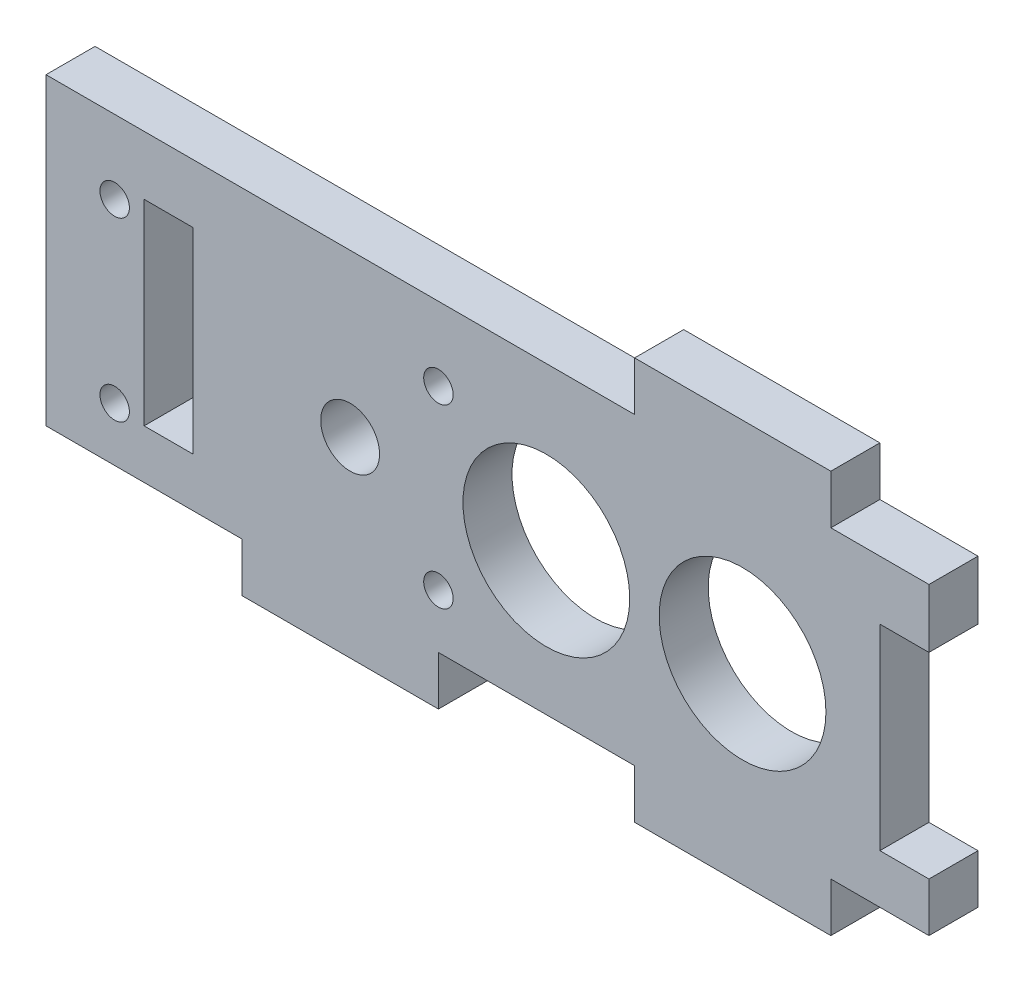
ISO-10303-21;
HEADER;
FILE_DESCRIPTION(('STEP AP214'),'2;1');
FILE_NAME('part.step','',(''),(''),'','','');
FILE_SCHEMA(('AUTOMOTIVE_DESIGN { 1 0 10303 214 1 1 1 1 }'));
ENDSEC;
DATA;
#1=APPLICATION_CONTEXT('core data for automotive mechanical design processes');
#2=APPLICATION_PROTOCOL_DEFINITION('international standard','automotive_design',2000,#1);
#3=PRODUCT_CONTEXT('',#1,'mechanical');
#4=PRODUCT('Part','Part','',(#3));
#5=PRODUCT_RELATED_PRODUCT_CATEGORY('part','',(#4));
#6=PRODUCT_DEFINITION_FORMATION('','',#4);
#7=PRODUCT_DEFINITION_CONTEXT('part definition',#1,'design');
#8=PRODUCT_DEFINITION('design','',#6,#7);
#9=PRODUCT_DEFINITION_SHAPE('','',#8);
#10=(LENGTH_UNIT() NAMED_UNIT(*) SI_UNIT(.MILLI.,.METRE.));
#11=(NAMED_UNIT(*) PLANE_ANGLE_UNIT() SI_UNIT($,.RADIAN.));
#12=(NAMED_UNIT(*) SI_UNIT($,.STERADIAN.) SOLID_ANGLE_UNIT());
#13=UNCERTAINTY_MEASURE_WITH_UNIT(LENGTH_MEASURE(1.E-05),#10,'distance_accuracy_value','');
#14=(GEOMETRIC_REPRESENTATION_CONTEXT(3) GLOBAL_UNCERTAINTY_ASSIGNED_CONTEXT((#13)) GLOBAL_UNIT_ASSIGNED_CONTEXT((#10,
#11,#12)) REPRESENTATION_CONTEXT('',''));
#15=CARTESIAN_POINT('',(0.,0.,0.));
#16=DIRECTION('',(0.,0.,1.));
#17=DIRECTION('',(1.,0.,0.));
#18=AXIS2_PLACEMENT_3D('',#15,#16,#17);
#19=CARTESIAN_POINT('',(0.,31.,-5.));
#20=DIRECTION('',(0.,-1.,0.));
#21=DIRECTION('',(0.,0.,-1.));
#22=AXIS2_PLACEMENT_3D('',#19,#20,#21);
#23=PLANE('',#22);
#24=DIRECTION('',(1.,0.,0.));
#25=VECTOR('',#24,1.);
#26=CARTESIAN_POINT('',(0.,31.,0.));
#27=LINE('',#26,#25);
#28=CARTESIAN_POINT('',(-10.,31.,0.));
#29=VERTEX_POINT('',#28);
#30=CARTESIAN_POINT('',(50.,31.,0.));
#31=VERTEX_POINT('',#30);
#32=EDGE_CURVE('E322',#29,#31,#27,.T.);
#33=ORIENTED_EDGE('',*,*,#32,.T.);
#34=DIRECTION('',(0.,0.,1.));
#35=VECTOR('',#34,1.);
#36=CARTESIAN_POINT('',(50.,31.,-5.));
#37=LINE('',#36,#35);
#38=CARTESIAN_POINT('',(50.,31.,-5.));
#39=VERTEX_POINT('',#38);
#40=EDGE_CURVE('E11',#39,#31,#37,.T.);
#41=ORIENTED_EDGE('',*,*,#40,.F.);
#42=DIRECTION('',(1.,0.,0.));
#43=VECTOR('',#42,1.);
#44=CARTESIAN_POINT('',(0.,31.,-5.));
#45=LINE('',#44,#43);
#46=CARTESIAN_POINT('',(-10.,31.,-5.));
#47=VERTEX_POINT('',#46);
#48=EDGE_CURVE('E259',#47,#39,#45,.T.);
#49=ORIENTED_EDGE('',*,*,#48,.F.);
#50=DIRECTION('',(0.,0.,-1.));
#51=VECTOR('',#50,1.);
#52=CARTESIAN_POINT('',(-10.,31.,-5.));
#53=LINE('',#52,#51);
#54=EDGE_CURVE('E245',#29,#47,#53,.T.);
#55=ORIENTED_EDGE('',*,*,#54,.F.);
#56=EDGE_LOOP('',(#33,#41,#49,#55));
#57=FACE_BOUND('',#56,.T.);
#58=ADVANCED_FACE('F36',(#57),#23,.F.);
#59=CARTESIAN_POINT('',(50.,0.,-5.));
#60=DIRECTION('',(1.,0.,0.));
#61=DIRECTION('',(0.,0.,-1.));
#62=AXIS2_PLACEMENT_3D('',#59,#60,#61);
#63=PLANE('',#62);
#64=DIRECTION('',(0.,1.,0.));
#65=VECTOR('',#64,1.);
#66=CARTESIAN_POINT('',(50.,0.,0.));
#67=LINE('',#66,#65);
#68=CARTESIAN_POINT('',(50.,36.,0.));
#69=VERTEX_POINT('',#68);
#70=EDGE_CURVE('E374',#31,#69,#67,.T.);
#71=ORIENTED_EDGE('',*,*,#70,.T.);
#72=DIRECTION('',(0.,0.,1.));
#73=VECTOR('',#72,1.);
#74=CARTESIAN_POINT('',(50.,36.,-5.));
#75=LINE('',#74,#73);
#76=CARTESIAN_POINT('',(50.,36.,-5.));
#77=VERTEX_POINT('',#76);
#78=EDGE_CURVE('E45',#77,#69,#75,.T.);
#79=ORIENTED_EDGE('',*,*,#78,.F.);
#80=DIRECTION('',(0.,1.,0.));
#81=VECTOR('',#80,1.);
#82=CARTESIAN_POINT('',(50.,0.,-5.));
#83=LINE('',#82,#81);
#84=EDGE_CURVE('E306',#39,#77,#83,.T.);
#85=ORIENTED_EDGE('',*,*,#84,.F.);
#86=ORIENTED_EDGE('',*,*,#40,.T.);
#87=EDGE_LOOP('',(#71,#79,#85,#86));
#88=FACE_BOUND('',#87,.T.);
#89=ADVANCED_FACE('F499',(#88),#63,.F.);
#90=CARTESIAN_POINT('',(0.,36.,-5.));
#91=DIRECTION('',(0.,-1.,0.));
#92=DIRECTION('',(0.,0.,-1.));
#93=AXIS2_PLACEMENT_3D('',#90,#91,#92);
#94=PLANE('',#93);
#95=DIRECTION('',(1.,0.,0.));
#96=VECTOR('',#95,1.);
#97=CARTESIAN_POINT('',(0.,36.,0.));
#98=LINE('',#97,#96);
#99=CARTESIAN_POINT('',(70.,36.,0.));
#100=VERTEX_POINT('',#99);
#101=EDGE_CURVE('E371',#69,#100,#98,.T.);
#102=ORIENTED_EDGE('',*,*,#101,.T.);
#103=DIRECTION('',(0.,0.,1.));
#104=VECTOR('',#103,1.);
#105=CARTESIAN_POINT('',(70.,36.,-5.));
#106=LINE('',#105,#104);
#107=CARTESIAN_POINT('',(70.,36.,-5.));
#108=VERTEX_POINT('',#107);
#109=EDGE_CURVE('E383',#108,#100,#106,.T.);
#110=ORIENTED_EDGE('',*,*,#109,.F.);
#111=DIRECTION('',(1.,0.,0.));
#112=VECTOR('',#111,1.);
#113=CARTESIAN_POINT('',(0.,36.,-5.));
#114=LINE('',#113,#112);
#115=EDGE_CURVE('E304',#77,#108,#114,.T.);
#116=ORIENTED_EDGE('',*,*,#115,.F.);
#117=ORIENTED_EDGE('',*,*,#78,.T.);
#118=EDGE_LOOP('',(#102,#110,#116,#117));
#119=FACE_BOUND('',#118,.T.);
#120=ADVANCED_FACE('F497',(#119),#94,.F.);
#121=CARTESIAN_POINT('',(70.,0.,-5.));
#122=DIRECTION('',(1.,0.,0.));
#123=DIRECTION('',(0.,0.,-1.));
#124=AXIS2_PLACEMENT_3D('',#121,#122,#123);
#125=PLANE('',#124);
#126=DIRECTION('',(0.,1.,0.));
#127=VECTOR('',#126,1.);
#128=CARTESIAN_POINT('',(70.,0.,0.));
#129=LINE('',#128,#127);
#130=CARTESIAN_POINT('',(70.,31.,0.));
#131=VERTEX_POINT('',#130);
#132=EDGE_CURVE('E368',#131,#100,#129,.T.);
#133=ORIENTED_EDGE('',*,*,#132,.F.);
#134=DIRECTION('',(0.,0.,1.));
#135=VECTOR('',#134,1.);
#136=CARTESIAN_POINT('',(70.,31.,-5.));
#137=LINE('',#136,#135);
#138=CARTESIAN_POINT('',(70.,31.,-5.));
#139=VERTEX_POINT('',#138);
#140=EDGE_CURVE('E385',#139,#131,#137,.T.);
#141=ORIENTED_EDGE('',*,*,#140,.F.);
#142=DIRECTION('',(0.,1.,0.));
#143=VECTOR('',#142,1.);
#144=CARTESIAN_POINT('',(70.,0.,-5.));
#145=LINE('',#144,#143);
#146=EDGE_CURVE('E301',#139,#108,#145,.T.);
#147=ORIENTED_EDGE('',*,*,#146,.T.);
#148=ORIENTED_EDGE('',*,*,#109,.T.);
#149=EDGE_LOOP('',(#133,#141,#147,#148));
#150=FACE_BOUND('',#149,.T.);
#151=ADVANCED_FACE('F492',(#150),#125,.T.);
#152=CARTESIAN_POINT('',(0.,31.,-5.));
#153=DIRECTION('',(0.,-1.,0.));
#154=DIRECTION('',(0.,0.,-1.));
#155=AXIS2_PLACEMENT_3D('',#152,#153,#154);
#156=PLANE('',#155);
#157=DIRECTION('',(1.,0.,0.));
#158=VECTOR('',#157,1.);
#159=CARTESIAN_POINT('',(0.,31.,0.));
#160=LINE('',#159,#158);
#161=CARTESIAN_POINT('',(80.,31.,0.));
#162=VERTEX_POINT('',#161);
#163=EDGE_CURVE('E365',#131,#162,#160,.T.);
#164=ORIENTED_EDGE('',*,*,#163,.T.);
#165=DIRECTION('',(0.,0.,1.));
#166=VECTOR('',#165,1.);
#167=CARTESIAN_POINT('',(80.,31.,-5.));
#168=LINE('',#167,#166);
#169=CARTESIAN_POINT('',(80.,31.,-5.));
#170=VERTEX_POINT('',#169);
#171=EDGE_CURVE('E387',#170,#162,#168,.T.);
#172=ORIENTED_EDGE('',*,*,#171,.F.);
#173=DIRECTION('',(1.,0.,0.));
#174=VECTOR('',#173,1.);
#175=CARTESIAN_POINT('',(0.,31.,-5.));
#176=LINE('',#175,#174);
#177=EDGE_CURVE('E299',#139,#170,#176,.T.);
#178=ORIENTED_EDGE('',*,*,#177,.F.);
#179=ORIENTED_EDGE('',*,*,#140,.T.);
#180=EDGE_LOOP('',(#164,#172,#178,#179));
#181=FACE_BOUND('',#180,.T.);
#182=ADVANCED_FACE('F488',(#181),#156,.F.);
#183=CARTESIAN_POINT('',(80.,0.,-5.));
#184=DIRECTION('',(1.,0.,0.));
#185=DIRECTION('',(0.,0.,-1.));
#186=AXIS2_PLACEMENT_3D('',#183,#184,#185);
#187=PLANE('',#186);
#188=DIRECTION('',(0.,1.,0.));
#189=VECTOR('',#188,1.);
#190=CARTESIAN_POINT('',(80.,0.,0.));
#191=LINE('',#190,#189);
#192=CARTESIAN_POINT('',(80.,25.,0.));
#193=VERTEX_POINT('',#192);
#194=EDGE_CURVE('E362',#193,#162,#191,.T.);
#195=ORIENTED_EDGE('',*,*,#194,.F.);
#196=DIRECTION('',(0.,0.,1.));
#197=VECTOR('',#196,1.);
#198=CARTESIAN_POINT('',(80.,25.,-5.));
#199=LINE('',#198,#197);
#200=CARTESIAN_POINT('',(80.,25.,-5.));
#201=VERTEX_POINT('',#200);
#202=EDGE_CURVE('E389',#201,#193,#199,.T.);
#203=ORIENTED_EDGE('',*,*,#202,.F.);
#204=DIRECTION('',(0.,1.,0.));
#205=VECTOR('',#204,1.);
#206=CARTESIAN_POINT('',(80.,0.,-5.));
#207=LINE('',#206,#205);
#208=EDGE_CURVE('E296',#201,#170,#207,.T.);
#209=ORIENTED_EDGE('',*,*,#208,.T.);
#210=ORIENTED_EDGE('',*,*,#171,.T.);
#211=EDGE_LOOP('',(#195,#203,#209,#210));
#212=FACE_BOUND('',#211,.T.);
#213=ADVANCED_FACE('F482',(#212),#187,.T.);
#214=CARTESIAN_POINT('',(0.,25.,-5.));
#215=DIRECTION('',(0.,1.,0.));
#216=DIRECTION('',(0.,0.,1.));
#217=AXIS2_PLACEMENT_3D('',#214,#215,#216);
#218=PLANE('',#217);
#219=DIRECTION('',(-1.,0.,0.));
#220=VECTOR('',#219,1.);
#221=CARTESIAN_POINT('',(0.,25.,0.));
#222=LINE('',#221,#220);
#223=CARTESIAN_POINT('',(75.,25.,0.));
#224=VERTEX_POINT('',#223);
#225=EDGE_CURVE('E360',#193,#224,#222,.T.);
#226=ORIENTED_EDGE('',*,*,#225,.T.);
#227=DIRECTION('',(0.,0.,1.));
#228=VECTOR('',#227,1.);
#229=CARTESIAN_POINT('',(75.,25.,-5.));
#230=LINE('',#229,#228);
#231=CARTESIAN_POINT('',(75.,25.,-5.));
#232=VERTEX_POINT('',#231);
#233=EDGE_CURVE('E391',#232,#224,#230,.T.);
#234=ORIENTED_EDGE('',*,*,#233,.F.);
#235=DIRECTION('',(-1.,0.,0.));
#236=VECTOR('',#235,1.);
#237=CARTESIAN_POINT('',(0.,25.,-5.));
#238=LINE('',#237,#236);
#239=EDGE_CURVE('E294',#201,#232,#238,.T.);
#240=ORIENTED_EDGE('',*,*,#239,.F.);
#241=ORIENTED_EDGE('',*,*,#202,.T.);
#242=EDGE_LOOP('',(#226,#234,#240,#241));
#243=FACE_BOUND('',#242,.T.);
#244=ADVANCED_FACE('F500',(#243),#218,.F.);
#245=CARTESIAN_POINT('',(75.,0.,-5.));
#246=DIRECTION('',(-1.,0.,0.));
#247=DIRECTION('',(0.,0.,1.));
#248=AXIS2_PLACEMENT_3D('',#245,#246,#247);
#249=PLANE('',#248);
#250=DIRECTION('',(0.,-1.,0.));
#251=VECTOR('',#250,1.);
#252=CARTESIAN_POINT('',(75.,0.,0.));
#253=LINE('',#252,#251);
#254=CARTESIAN_POINT('',(75.,5.00000000000001,0.));
#255=VERTEX_POINT('',#254);
#256=EDGE_CURVE('E357',#224,#255,#253,.T.);
#257=ORIENTED_EDGE('',*,*,#256,.T.);
#258=DIRECTION('',(0.,0.,1.));
#259=VECTOR('',#258,1.);
#260=CARTESIAN_POINT('',(75.,5.00000000000001,-5.));
#261=LINE('',#260,#259);
#262=CARTESIAN_POINT('',(75.,5.00000000000001,-5.));
#263=VERTEX_POINT('',#262);
#264=EDGE_CURVE('E394',#263,#255,#261,.T.);
#265=ORIENTED_EDGE('',*,*,#264,.F.);
#266=DIRECTION('',(0.,-1.,0.));
#267=VECTOR('',#266,1.);
#268=CARTESIAN_POINT('',(75.,0.,-5.));
#269=LINE('',#268,#267);
#270=EDGE_CURVE('E292',#232,#263,#269,.T.);
#271=ORIENTED_EDGE('',*,*,#270,.F.);
#272=ORIENTED_EDGE('',*,*,#233,.T.);
#273=EDGE_LOOP('',(#257,#265,#271,#272));
#274=FACE_BOUND('',#273,.T.);
#275=ADVANCED_FACE('F475',(#274),#249,.F.);
#276=CARTESIAN_POINT('',(0.,5.,-5.));
#277=DIRECTION('',(0.,1.,0.));
#278=DIRECTION('',(-1.,0.,0.));
#279=AXIS2_PLACEMENT_3D('',#276,#277,#278);
#280=PLANE('',#279);
#281=DIRECTION('',(-1.,0.,0.));
#282=VECTOR('',#281,1.);
#283=CARTESIAN_POINT('',(0.,5.,0.));
#284=LINE('',#283,#282);
#285=CARTESIAN_POINT('',(80.,5.00000000000002,0.));
#286=VERTEX_POINT('',#285);
#287=EDGE_CURVE('E354',#286,#255,#284,.T.);
#288=ORIENTED_EDGE('',*,*,#287,.F.);
#289=DIRECTION('',(0.,0.,1.));
#290=VECTOR('',#289,1.);
#291=CARTESIAN_POINT('',(80.,5.00000000000002,-5.));
#292=LINE('',#291,#290);
#293=CARTESIAN_POINT('',(80.,5.00000000000002,-5.));
#294=VERTEX_POINT('',#293);
#295=EDGE_CURVE('E396',#294,#286,#292,.T.);
#296=ORIENTED_EDGE('',*,*,#295,.F.);
#297=DIRECTION('',(-1.,0.,0.));
#298=VECTOR('',#297,1.);
#299=CARTESIAN_POINT('',(0.,5.,-5.));
#300=LINE('',#299,#298);
#301=EDGE_CURVE('E289',#294,#263,#300,.T.);
#302=ORIENTED_EDGE('',*,*,#301,.T.);
#303=ORIENTED_EDGE('',*,*,#264,.T.);
#304=EDGE_LOOP('',(#288,#296,#302,#303));
#305=FACE_BOUND('',#304,.T.);
#306=ADVANCED_FACE('F471',(#305),#280,.T.);
#307=CARTESIAN_POINT('',(80.,0.,-5.));
#308=DIRECTION('',(1.,0.,0.));
#309=DIRECTION('',(0.,0.,-1.));
#310=AXIS2_PLACEMENT_3D('',#307,#308,#309);
#311=PLANE('',#310);
#312=DIRECTION('',(0.,1.,0.));
#313=VECTOR('',#312,1.);
#314=CARTESIAN_POINT('',(80.,0.,0.));
#315=LINE('',#314,#313);
#316=CARTESIAN_POINT('',(80.,0.,0.));
#317=VERTEX_POINT('',#316);
#318=EDGE_CURVE('E351',#317,#286,#315,.T.);
#319=ORIENTED_EDGE('',*,*,#318,.F.);
#320=DIRECTION('',(0.,0.,1.));
#321=VECTOR('',#320,1.);
#322=CARTESIAN_POINT('',(80.,0.,-5.));
#323=LINE('',#322,#321);
#324=CARTESIAN_POINT('',(80.,0.,-5.));
#325=VERTEX_POINT('',#324);
#326=EDGE_CURVE('E398',#325,#317,#323,.T.);
#327=ORIENTED_EDGE('',*,*,#326,.F.);
#328=DIRECTION('',(0.,1.,0.));
#329=VECTOR('',#328,1.);
#330=CARTESIAN_POINT('',(80.,0.,-5.));
#331=LINE('',#330,#329);
#332=EDGE_CURVE('E286',#325,#294,#331,.T.);
#333=ORIENTED_EDGE('',*,*,#332,.T.);
#334=ORIENTED_EDGE('',*,*,#295,.T.);
#335=EDGE_LOOP('',(#319,#327,#333,#334));
#336=FACE_BOUND('',#335,.T.);
#337=ADVANCED_FACE('F467',(#336),#311,.T.);
#338=CARTESIAN_POINT('',(0.,0.,-5.));
#339=DIRECTION('',(0.,-1.,0.));
#340=DIRECTION('',(1.,0.,0.));
#341=AXIS2_PLACEMENT_3D('',#338,#339,#340);
#342=PLANE('',#341);
#343=DIRECTION('',(1.,0.,0.));
#344=VECTOR('',#343,1.);
#345=CARTESIAN_POINT('',(0.,0.,0.));
#346=LINE('',#345,#344);
#347=CARTESIAN_POINT('',(70.,0.,0.));
#348=VERTEX_POINT('',#347);
#349=EDGE_CURVE('E348',#348,#317,#346,.T.);
#350=ORIENTED_EDGE('',*,*,#349,.F.);
#351=DIRECTION('',(0.,0.,1.));
#352=VECTOR('',#351,1.);
#353=CARTESIAN_POINT('',(70.,0.,-5.));
#354=LINE('',#353,#352);
#355=CARTESIAN_POINT('',(70.,0.,-5.));
#356=VERTEX_POINT('',#355);
#357=EDGE_CURVE('E400',#356,#348,#354,.T.);
#358=ORIENTED_EDGE('',*,*,#357,.F.);
#359=DIRECTION('',(1.,0.,0.));
#360=VECTOR('',#359,1.);
#361=CARTESIAN_POINT('',(0.,0.,-5.));
#362=LINE('',#361,#360);
#363=EDGE_CURVE('E283',#356,#325,#362,.T.);
#364=ORIENTED_EDGE('',*,*,#363,.T.);
#365=ORIENTED_EDGE('',*,*,#326,.T.);
#366=EDGE_LOOP('',(#350,#358,#364,#365));
#367=FACE_BOUND('',#366,.T.);
#368=ADVANCED_FACE('F462',(#367),#342,.T.);
#369=CARTESIAN_POINT('',(70.,0.,-5.));
#370=DIRECTION('',(-1.,0.,0.));
#371=DIRECTION('',(0.,0.,1.));
#372=AXIS2_PLACEMENT_3D('',#369,#370,#371);
#373=PLANE('',#372);
#374=DIRECTION('',(0.,-1.,0.));
#375=VECTOR('',#374,1.);
#376=CARTESIAN_POINT('',(70.,0.,0.));
#377=LINE('',#376,#375);
#378=CARTESIAN_POINT('',(70.,-5.,0.));
#379=VERTEX_POINT('',#378);
#380=EDGE_CURVE('E346',#348,#379,#377,.T.);
#381=ORIENTED_EDGE('',*,*,#380,.T.);
#382=DIRECTION('',(0.,0.,1.));
#383=VECTOR('',#382,1.);
#384=CARTESIAN_POINT('',(70.,-5.,-5.));
#385=LINE('',#384,#383);
#386=CARTESIAN_POINT('',(70.,-5.,-5.));
#387=VERTEX_POINT('',#386);
#388=EDGE_CURVE('E402',#387,#379,#385,.T.);
#389=ORIENTED_EDGE('',*,*,#388,.F.);
#390=DIRECTION('',(0.,-1.,0.));
#391=VECTOR('',#390,1.);
#392=CARTESIAN_POINT('',(70.,0.,-5.));
#393=LINE('',#392,#391);
#394=EDGE_CURVE('E281',#356,#387,#393,.T.);
#395=ORIENTED_EDGE('',*,*,#394,.F.);
#396=ORIENTED_EDGE('',*,*,#357,.T.);
#397=EDGE_LOOP('',(#381,#389,#395,#396));
#398=FACE_BOUND('',#397,.T.);
#399=ADVANCED_FACE('F459',(#398),#373,.F.);
#400=CARTESIAN_POINT('',(0.,-5.00000000000001,-5.));
#401=DIRECTION('',(0.,1.,0.));
#402=DIRECTION('',(-1.,0.,0.));
#403=AXIS2_PLACEMENT_3D('',#400,#401,#402);
#404=PLANE('',#403);
#405=DIRECTION('',(-1.,0.,0.));
#406=VECTOR('',#405,1.);
#407=CARTESIAN_POINT('',(0.,-5.00000000000001,0.));
#408=LINE('',#407,#406);
#409=CARTESIAN_POINT('',(50.,-5.,0.));
#410=VERTEX_POINT('',#409);
#411=EDGE_CURVE('E343',#379,#410,#408,.T.);
#412=ORIENTED_EDGE('',*,*,#411,.T.);
#413=DIRECTION('',(0.,0.,1.));
#414=VECTOR('',#413,1.);
#415=CARTESIAN_POINT('',(50.,-5.,-5.));
#416=LINE('',#415,#414);
#417=CARTESIAN_POINT('',(50.,-5.,-5.));
#418=VERTEX_POINT('',#417);
#419=EDGE_CURVE('E405',#418,#410,#416,.T.);
#420=ORIENTED_EDGE('',*,*,#419,.F.);
#421=DIRECTION('',(-1.,0.,0.));
#422=VECTOR('',#421,1.);
#423=CARTESIAN_POINT('',(0.,-5.00000000000001,-5.));
#424=LINE('',#423,#422);
#425=EDGE_CURVE('E279',#387,#418,#424,.T.);
#426=ORIENTED_EDGE('',*,*,#425,.F.);
#427=ORIENTED_EDGE('',*,*,#388,.T.);
#428=EDGE_LOOP('',(#412,#420,#426,#427));
#429=FACE_BOUND('',#428,.T.);
#430=ADVANCED_FACE('F454',(#429),#404,.F.);
#431=CARTESIAN_POINT('',(50.,0.,-5.));
#432=DIRECTION('',(-1.,0.,0.));
#433=DIRECTION('',(0.,-1.,0.));
#434=AXIS2_PLACEMENT_3D('',#431,#432,#433);
#435=PLANE('',#434);
#436=DIRECTION('',(0.,-1.,0.));
#437=VECTOR('',#436,1.);
#438=CARTESIAN_POINT('',(50.,0.,0.));
#439=LINE('',#438,#437);
#440=CARTESIAN_POINT('',(50.,0.,0.));
#441=VERTEX_POINT('',#440);
#442=EDGE_CURVE('E340',#441,#410,#439,.T.);
#443=ORIENTED_EDGE('',*,*,#442,.F.);
#444=DIRECTION('',(0.,0.,1.));
#445=VECTOR('',#444,1.);
#446=CARTESIAN_POINT('',(50.,0.,-5.));
#447=LINE('',#446,#445);
#448=CARTESIAN_POINT('',(50.,0.,-5.));
#449=VERTEX_POINT('',#448);
#450=EDGE_CURVE('E407',#449,#441,#447,.T.);
#451=ORIENTED_EDGE('',*,*,#450,.F.);
#452=DIRECTION('',(0.,-1.,0.));
#453=VECTOR('',#452,1.);
#454=CARTESIAN_POINT('',(50.,0.,-5.));
#455=LINE('',#454,#453);
#456=EDGE_CURVE('E276',#449,#418,#455,.T.);
#457=ORIENTED_EDGE('',*,*,#456,.T.);
#458=ORIENTED_EDGE('',*,*,#419,.T.);
#459=EDGE_LOOP('',(#443,#451,#457,#458));
#460=FACE_BOUND('',#459,.T.);
#461=ADVANCED_FACE('F448',(#460),#435,.T.);
#462=CARTESIAN_POINT('',(0.,0.,-5.));
#463=DIRECTION('',(0.,-1.,0.));
#464=DIRECTION('',(1.,0.,0.));
#465=AXIS2_PLACEMENT_3D('',#462,#463,#464);
#466=PLANE('',#465);
#467=DIRECTION('',(1.,0.,0.));
#468=VECTOR('',#467,1.);
#469=CARTESIAN_POINT('',(0.,0.,0.));
#470=LINE('',#469,#468);
#471=CARTESIAN_POINT('',(30.,0.,0.));
#472=VERTEX_POINT('',#471);
#473=EDGE_CURVE('E337',#472,#441,#470,.T.);
#474=ORIENTED_EDGE('',*,*,#473,.F.);
#475=DIRECTION('',(0.,0.,1.));
#476=VECTOR('',#475,1.);
#477=CARTESIAN_POINT('',(30.,0.,-5.));
#478=LINE('',#477,#476);
#479=CARTESIAN_POINT('',(30.,0.,-5.));
#480=VERTEX_POINT('',#479);
#481=EDGE_CURVE('E409',#480,#472,#478,.T.);
#482=ORIENTED_EDGE('',*,*,#481,.F.);
#483=DIRECTION('',(1.,0.,0.));
#484=VECTOR('',#483,1.);
#485=CARTESIAN_POINT('',(0.,0.,-5.));
#486=LINE('',#485,#484);
#487=EDGE_CURVE('E273',#480,#449,#486,.T.);
#488=ORIENTED_EDGE('',*,*,#487,.T.);
#489=ORIENTED_EDGE('',*,*,#450,.T.);
#490=EDGE_LOOP('',(#474,#482,#488,#489));
#491=FACE_BOUND('',#490,.T.);
#492=ADVANCED_FACE('F444',(#491),#466,.T.);
#493=CARTESIAN_POINT('',(30.,0.,-5.));
#494=DIRECTION('',(-1.,0.,0.));
#495=DIRECTION('',(0.,0.,1.));
#496=AXIS2_PLACEMENT_3D('',#493,#494,#495);
#497=PLANE('',#496);
#498=DIRECTION('',(0.,-1.,0.));
#499=VECTOR('',#498,1.);
#500=CARTESIAN_POINT('',(30.,0.,0.));
#501=LINE('',#500,#499);
#502=CARTESIAN_POINT('',(30.,-5.,0.));
#503=VERTEX_POINT('',#502);
#504=EDGE_CURVE('E334',#472,#503,#501,.T.);
#505=ORIENTED_EDGE('',*,*,#504,.T.);
#506=DIRECTION('',(0.,0.,1.));
#507=VECTOR('',#506,1.);
#508=CARTESIAN_POINT('',(30.,-5.,-5.));
#509=LINE('',#508,#507);
#510=CARTESIAN_POINT('',(30.,-5.,-5.));
#511=VERTEX_POINT('',#510);
#512=EDGE_CURVE('E411',#511,#503,#509,.T.);
#513=ORIENTED_EDGE('',*,*,#512,.F.);
#514=DIRECTION('',(0.,-1.,0.));
#515=VECTOR('',#514,1.);
#516=CARTESIAN_POINT('',(30.,0.,-5.));
#517=LINE('',#516,#515);
#518=EDGE_CURVE('E271',#480,#511,#517,.T.);
#519=ORIENTED_EDGE('',*,*,#518,.F.);
#520=ORIENTED_EDGE('',*,*,#481,.T.);
#521=EDGE_LOOP('',(#505,#513,#519,#520));
#522=FACE_BOUND('',#521,.T.);
#523=ADVANCED_FACE('F639',(#522),#497,.F.);
#524=CARTESIAN_POINT('',(0.,-5.,-5.));
#525=DIRECTION('',(0.,-1.,0.));
#526=DIRECTION('',(1.,0.,0.));
#527=AXIS2_PLACEMENT_3D('',#524,#525,#526);
#528=PLANE('',#527);
#529=DIRECTION('',(1.,0.,0.));
#530=VECTOR('',#529,1.);
#531=CARTESIAN_POINT('',(0.,-5.,0.));
#532=LINE('',#531,#530);
#533=CARTESIAN_POINT('',(10.,-5.,0.));
#534=VERTEX_POINT('',#533);
#535=EDGE_CURVE('E331',#534,#503,#532,.T.);
#536=ORIENTED_EDGE('',*,*,#535,.F.);
#537=DIRECTION('',(0.,0.,1.));
#538=VECTOR('',#537,1.);
#539=CARTESIAN_POINT('',(10.,-5.,-5.));
#540=LINE('',#539,#538);
#541=CARTESIAN_POINT('',(10.,-5.,-5.));
#542=VERTEX_POINT('',#541);
#543=EDGE_CURVE('E412',#542,#534,#540,.T.);
#544=ORIENTED_EDGE('',*,*,#543,.F.);
#545=DIRECTION('',(1.,0.,0.));
#546=VECTOR('',#545,1.);
#547=CARTESIAN_POINT('',(0.,-5.,-5.));
#548=LINE('',#547,#546);
#549=EDGE_CURVE('E268',#542,#511,#548,.T.);
#550=ORIENTED_EDGE('',*,*,#549,.T.);
#551=ORIENTED_EDGE('',*,*,#512,.T.);
#552=EDGE_LOOP('',(#536,#544,#550,#551));
#553=FACE_BOUND('',#552,.T.);
#554=ADVANCED_FACE('F439',(#553),#528,.T.);
#555=CARTESIAN_POINT('',(10.,0.,-5.));
#556=DIRECTION('',(-1.,0.,0.));
#557=DIRECTION('',(0.,-1.,0.));
#558=AXIS2_PLACEMENT_3D('',#555,#556,#557);
#559=PLANE('',#558);
#560=DIRECTION('',(0.,-1.,0.));
#561=VECTOR('',#560,1.);
#562=CARTESIAN_POINT('',(10.,0.,0.));
#563=LINE('',#562,#561);
#564=CARTESIAN_POINT('',(10.,0.,0.));
#565=VERTEX_POINT('',#564);
#566=EDGE_CURVE('E328',#565,#534,#563,.T.);
#567=ORIENTED_EDGE('',*,*,#566,.F.);
#568=DIRECTION('',(0.,0.,1.));
#569=VECTOR('',#568,1.);
#570=CARTESIAN_POINT('',(10.,0.,-5.));
#571=LINE('',#570,#569);
#572=CARTESIAN_POINT('',(10.,0.,-5.));
#573=VERTEX_POINT('',#572);
#574=EDGE_CURVE('E40',#573,#565,#571,.T.);
#575=ORIENTED_EDGE('',*,*,#574,.F.);
#576=DIRECTION('',(0.,-1.,0.));
#577=VECTOR('',#576,1.);
#578=CARTESIAN_POINT('',(10.,0.,-5.));
#579=LINE('',#578,#577);
#580=EDGE_CURVE('E265',#573,#542,#579,.T.);
#581=ORIENTED_EDGE('',*,*,#580,.T.);
#582=ORIENTED_EDGE('',*,*,#543,.T.);
#583=EDGE_LOOP('',(#567,#575,#581,#582));
#584=FACE_BOUND('',#583,.T.);
#585=ADVANCED_FACE('F420',(#584),#559,.T.);
#586=CARTESIAN_POINT('',(0.,0.,-5.));
#587=DIRECTION('',(0.,-1.,0.));
#588=DIRECTION('',(1.,0.,0.));
#589=AXIS2_PLACEMENT_3D('',#586,#587,#588);
#590=PLANE('',#589);
#591=DIRECTION('',(1.,0.,0.));
#592=VECTOR('',#591,1.);
#593=CARTESIAN_POINT('',(0.,0.,0.));
#594=LINE('',#593,#592);
#595=CARTESIAN_POINT('',(-10.,0.,0.));
#596=VERTEX_POINT('',#595);
#597=EDGE_CURVE('E325',#596,#565,#594,.T.);
#598=ORIENTED_EDGE('',*,*,#597,.F.);
#599=DIRECTION('',(0.,0.,1.));
#600=VECTOR('',#599,1.);
#601=CARTESIAN_POINT('',(-10.,0.,-5.));
#602=LINE('',#601,#600);
#603=CARTESIAN_POINT('',(-10.,0.,-5.));
#604=VERTEX_POINT('',#603);
#605=EDGE_CURVE('E239',#604,#596,#602,.T.);
#606=ORIENTED_EDGE('',*,*,#605,.F.);
#607=DIRECTION('',(1.,0.,0.));
#608=VECTOR('',#607,1.);
#609=CARTESIAN_POINT('',(0.,0.,-5.));
#610=LINE('',#609,#608);
#611=EDGE_CURVE('E262',#604,#573,#610,.T.);
#612=ORIENTED_EDGE('',*,*,#611,.T.);
#613=ORIENTED_EDGE('',*,*,#574,.T.);
#614=EDGE_LOOP('',(#598,#606,#612,#613));
#615=FACE_BOUND('',#614,.T.);
#616=ADVANCED_FACE('F417',(#615),#590,.T.);
#617=CARTESIAN_POINT('',(30.,5.5,-5.));
#618=DIRECTION('',(0.,0.,1.));
#619=DIRECTION('',(1.,0.,0.));
#620=AXIS2_PLACEMENT_3D('',#617,#618,#619);
#621=CYLINDRICAL_SURFACE('',#620,1.5);
#622=CARTESIAN_POINT('',(30.,5.5,-5.));
#623=DIRECTION('',(0.,0.,1.));
#624=DIRECTION('',(1.,0.,0.));
#625=AXIS2_PLACEMENT_3D('',#622,#623,#624);
#626=CIRCLE('',#625,1.5);
#627=CARTESIAN_POINT('',(31.5,5.5,-5.));
#628=VERTEX_POINT('',#627);
#629=EDGE_CURVE('E308',#628,#628,#626,.T.);
#630=ORIENTED_EDGE('',*,*,#629,.F.);
#631=EDGE_LOOP('',(#630));
#632=FACE_BOUND('',#631,.T.);
#633=CARTESIAN_POINT('',(30.,5.5,0.));
#634=DIRECTION('',(0.,0.,1.));
#635=DIRECTION('',(1.,0.,0.));
#636=AXIS2_PLACEMENT_3D('',#633,#634,#635);
#637=CIRCLE('',#636,1.5);
#638=CARTESIAN_POINT('',(31.5,5.5,0.));
#639=VERTEX_POINT('',#638);
#640=EDGE_CURVE('E376',#639,#639,#637,.T.);
#641=ORIENTED_EDGE('',*,*,#640,.T.);
#642=EDGE_LOOP('',(#641));
#643=FACE_BOUND('',#642,.T.);
#644=ADVANCED_FACE('F521',(#632,#643),#621,.F.);
#645=CARTESIAN_POINT('',(21.,14.5,-5.));
#646=DIRECTION('',(0.,0.,1.));
#647=DIRECTION('',(1.,0.,0.));
#648=AXIS2_PLACEMENT_3D('',#645,#646,#647);
#649=CYLINDRICAL_SURFACE('',#648,2.99999999999999);
#650=CARTESIAN_POINT('',(21.,14.5,-5.));
#651=DIRECTION('',(0.,0.,1.));
#652=DIRECTION('',(1.,0.,0.));
#653=AXIS2_PLACEMENT_3D('',#650,#651,#652);
#654=CIRCLE('',#653,2.99999999999999);
#655=CARTESIAN_POINT('',(24.,14.5,-5.));
#656=VERTEX_POINT('',#655);
#657=EDGE_CURVE('E256',#656,#656,#654,.T.);
#658=ORIENTED_EDGE('',*,*,#657,.F.);
#659=EDGE_LOOP('',(#658));
#660=FACE_BOUND('',#659,.T.);
#661=CARTESIAN_POINT('',(21.,14.5,0.));
#662=DIRECTION('',(0.,0.,1.));
#663=DIRECTION('',(1.,0.,0.));
#664=AXIS2_PLACEMENT_3D('',#661,#662,#663);
#665=CIRCLE('',#664,2.99999999999999);
#666=CARTESIAN_POINT('',(24.,14.5,0.));
#667=VERTEX_POINT('',#666);
#668=EDGE_CURVE('E319',#667,#667,#665,.T.);
#669=ORIENTED_EDGE('',*,*,#668,.T.);
#670=EDGE_LOOP('',(#669));
#671=FACE_BOUND('',#670,.T.);
#672=ADVANCED_FACE('F518',(#660,#671),#649,.F.);
#673=CARTESIAN_POINT('',(41.,14.5,-5.));
#674=DIRECTION('',(0.,0.,1.));
#675=DIRECTION('',(1.,0.,0.));
#676=AXIS2_PLACEMENT_3D('',#673,#674,#675);
#677=CYLINDRICAL_SURFACE('',#676,8.5);
#678=CARTESIAN_POINT('',(41.,14.5,-5.));
#679=DIRECTION('',(0.,0.,1.));
#680=DIRECTION('',(1.,0.,0.));
#681=AXIS2_PLACEMENT_3D('',#678,#679,#680);
#682=CIRCLE('',#681,8.5);
#683=CARTESIAN_POINT('',(49.5,14.5,-5.));
#684=VERTEX_POINT('',#683);
#685=EDGE_CURVE('E252',#684,#684,#682,.T.);
#686=ORIENTED_EDGE('',*,*,#685,.F.);
#687=EDGE_LOOP('',(#686));
#688=FACE_BOUND('',#687,.T.);
#689=CARTESIAN_POINT('',(41.,14.5,0.));
#690=DIRECTION('',(0.,0.,1.));
#691=DIRECTION('',(1.,0.,0.));
#692=AXIS2_PLACEMENT_3D('',#689,#690,#691);
#693=CIRCLE('',#692,8.5);
#694=CARTESIAN_POINT('',(49.5,14.5,0.));
#695=VERTEX_POINT('',#694);
#696=EDGE_CURVE('E316',#695,#695,#693,.T.);
#697=ORIENTED_EDGE('',*,*,#696,.T.);
#698=EDGE_LOOP('',(#697));
#699=FACE_BOUND('',#698,.T.);
#700=ADVANCED_FACE('F520',(#688,#699),#677,.F.);
#701=CARTESIAN_POINT('',(30.,23.5,-5.));
#702=DIRECTION('',(0.,0.,1.));
#703=DIRECTION('',(1.,0.,0.));
#704=AXIS2_PLACEMENT_3D('',#701,#702,#703);
#705=CYLINDRICAL_SURFACE('',#704,1.5);
#706=CARTESIAN_POINT('',(30.,23.5,-5.));
#707=DIRECTION('',(0.,0.,1.));
#708=DIRECTION('',(1.,0.,0.));
#709=AXIS2_PLACEMENT_3D('',#706,#707,#708);
#710=CIRCLE('',#709,1.5);
#711=CARTESIAN_POINT('',(31.5,23.5,-5.));
#712=VERTEX_POINT('',#711);
#713=EDGE_CURVE('E249',#712,#712,#710,.T.);
#714=ORIENTED_EDGE('',*,*,#713,.F.);
#715=EDGE_LOOP('',(#714));
#716=FACE_BOUND('',#715,.T.);
#717=CARTESIAN_POINT('',(30.,23.5,0.));
#718=DIRECTION('',(0.,0.,1.));
#719=DIRECTION('',(1.,0.,0.));
#720=AXIS2_PLACEMENT_3D('',#717,#718,#719);
#721=CIRCLE('',#720,1.5);
#722=CARTESIAN_POINT('',(31.5,23.5,0.));
#723=VERTEX_POINT('',#722);
#724=EDGE_CURVE('E248',#723,#723,#721,.T.);
#725=ORIENTED_EDGE('',*,*,#724,.T.);
#726=EDGE_LOOP('',(#725));
#727=FACE_BOUND('',#726,.T.);
#728=ADVANCED_FACE('F38',(#716,#727),#705,.F.);
#729=CARTESIAN_POINT('',(61.,14.5,-5.));
#730=DIRECTION('',(0.,0.,1.));
#731=DIRECTION('',(1.,0.,0.));
#732=AXIS2_PLACEMENT_3D('',#729,#730,#731);
#733=CYLINDRICAL_SURFACE('',#732,8.50000000000003);
#734=CARTESIAN_POINT('',(61.,14.5,-5.));
#735=DIRECTION('',(0.,0.,1.));
#736=DIRECTION('',(1.,0.,0.));
#737=AXIS2_PLACEMENT_3D('',#734,#735,#736);
#738=CIRCLE('',#737,8.50000000000003);
#739=CARTESIAN_POINT('',(69.5,14.5,-5.));
#740=VERTEX_POINT('',#739);
#741=EDGE_CURVE('E311',#740,#740,#738,.T.);
#742=ORIENTED_EDGE('',*,*,#741,.F.);
#743=EDGE_LOOP('',(#742));
#744=FACE_BOUND('',#743,.T.);
#745=CARTESIAN_POINT('',(61.,14.5,0.));
#746=DIRECTION('',(0.,0.,1.));
#747=DIRECTION('',(1.,0.,0.));
#748=AXIS2_PLACEMENT_3D('',#745,#746,#747);
#749=CIRCLE('',#748,8.50000000000003);
#750=CARTESIAN_POINT('',(69.5,14.5,0.));
#751=VERTEX_POINT('',#750);
#752=EDGE_CURVE('E253',#751,#751,#749,.T.);
#753=ORIENTED_EDGE('',*,*,#752,.T.);
#754=EDGE_LOOP('',(#753));
#755=FACE_BOUND('',#754,.T.);
#756=ADVANCED_FACE('F528',(#744,#755),#733,.F.);
#757=CARTESIAN_POINT('',(0.,0.,-5.));
#758=DIRECTION('',(0.,0.,1.));
#759=DIRECTION('',(1.,0.,0.));
#760=AXIS2_PLACEMENT_3D('',#757,#758,#759);
#761=PLANE('',#760);
#762=CARTESIAN_POINT('',(-3.,5.5,-5.));
#763=DIRECTION('',(0.,0.,1.));
#764=DIRECTION('',(1.,0.,0.));
#765=AXIS2_PLACEMENT_3D('',#762,#763,#764);
#766=CIRCLE('',#765,1.5);
#767=CARTESIAN_POINT('',(-1.5,5.5,-5.));
#768=VERTEX_POINT('',#767);
#769=EDGE_CURVE('E785',#768,#768,#766,.T.);
#770=ORIENTED_EDGE('',*,*,#769,.T.);
#771=EDGE_LOOP('',(#770));
#772=FACE_BOUND('',#771,.T.);
#773=CARTESIAN_POINT('',(-3.,23.5,-5.));
#774=DIRECTION('',(0.,0.,1.));
#775=DIRECTION('',(1.,0.,0.));
#776=AXIS2_PLACEMENT_3D('',#773,#774,#775);
#777=CIRCLE('',#776,1.5);
#778=CARTESIAN_POINT('',(-1.5,23.5,-5.));
#779=VERTEX_POINT('',#778);
#780=EDGE_CURVE('E789',#779,#779,#777,.T.);
#781=ORIENTED_EDGE('',*,*,#780,.T.);
#782=EDGE_LOOP('',(#781));
#783=FACE_BOUND('',#782,.T.);
#784=DIRECTION('',(1.,0.,0.));
#785=VECTOR('',#784,1.);
#786=CARTESIAN_POINT('',(0.,5.,-5.));
#787=LINE('',#786,#785);
#788=CARTESIAN_POINT('',(0.,5.,-5.));
#789=VERTEX_POINT('',#788);
#790=CARTESIAN_POINT('',(5.,5.,-5.));
#791=VERTEX_POINT('',#790);
#792=EDGE_CURVE('E230',#789,#791,#787,.T.);
#793=ORIENTED_EDGE('',*,*,#792,.T.);
#794=DIRECTION('',(0.,1.,0.));
#795=VECTOR('',#794,1.);
#796=CARTESIAN_POINT('',(5.,0.,-5.));
#797=LINE('',#796,#795);
#798=CARTESIAN_POINT('',(5.,25.,-5.));
#799=VERTEX_POINT('',#798);
#800=EDGE_CURVE('E233',#791,#799,#797,.T.);
#801=ORIENTED_EDGE('',*,*,#800,.T.);
#802=DIRECTION('',(-1.,0.,0.));
#803=VECTOR('',#802,1.);
#804=CARTESIAN_POINT('',(0.,25.,-5.));
#805=LINE('',#804,#803);
#806=CARTESIAN_POINT('',(0.,25.,-5.));
#807=VERTEX_POINT('',#806);
#808=EDGE_CURVE('E225',#799,#807,#805,.T.);
#809=ORIENTED_EDGE('',*,*,#808,.T.);
#810=DIRECTION('',(0.,-1.,0.));
#811=VECTOR('',#810,1.);
#812=CARTESIAN_POINT('',(0.,0.,-5.));
#813=LINE('',#812,#811);
#814=EDGE_CURVE('E205',#807,#789,#813,.T.);
#815=ORIENTED_EDGE('',*,*,#814,.T.);
#816=EDGE_LOOP('',(#793,#801,#809,#815));
#817=FACE_BOUND('',#816,.T.);
#818=ORIENTED_EDGE('',*,*,#713,.T.);
#819=EDGE_LOOP('',(#818));
#820=FACE_BOUND('',#819,.T.);
#821=ORIENTED_EDGE('',*,*,#685,.T.);
#822=EDGE_LOOP('',(#821));
#823=FACE_BOUND('',#822,.T.);
#824=ORIENTED_EDGE('',*,*,#657,.T.);
#825=EDGE_LOOP('',(#824));
#826=FACE_BOUND('',#825,.T.);
#827=ORIENTED_EDGE('',*,*,#48,.T.);
#828=ORIENTED_EDGE('',*,*,#84,.T.);
#829=ORIENTED_EDGE('',*,*,#115,.T.);
#830=ORIENTED_EDGE('',*,*,#146,.F.);
#831=ORIENTED_EDGE('',*,*,#177,.T.);
#832=ORIENTED_EDGE('',*,*,#208,.F.);
#833=ORIENTED_EDGE('',*,*,#239,.T.);
#834=ORIENTED_EDGE('',*,*,#270,.T.);
#835=ORIENTED_EDGE('',*,*,#301,.F.);
#836=ORIENTED_EDGE('',*,*,#332,.F.);
#837=ORIENTED_EDGE('',*,*,#363,.F.);
#838=ORIENTED_EDGE('',*,*,#394,.T.);
#839=ORIENTED_EDGE('',*,*,#425,.T.);
#840=ORIENTED_EDGE('',*,*,#456,.F.);
#841=ORIENTED_EDGE('',*,*,#487,.F.);
#842=ORIENTED_EDGE('',*,*,#518,.T.);
#843=ORIENTED_EDGE('',*,*,#549,.F.);
#844=ORIENTED_EDGE('',*,*,#580,.F.);
#845=ORIENTED_EDGE('',*,*,#611,.F.);
#846=DIRECTION('',(0.,-1.,0.));
#847=VECTOR('',#846,1.);
#848=CARTESIAN_POINT('',(-10.,31.,-5.));
#849=LINE('',#848,#847);
#850=EDGE_CURVE('E236',#47,#604,#849,.T.);
#851=ORIENTED_EDGE('',*,*,#850,.F.);
#852=EDGE_LOOP('',(#827,#828,#829,#830,#831,#832,#833,#834,#835,#836,#837,#838,#839,#840,#841,
#842,#843,#844,#845,#851));
#853=FACE_BOUND('',#852,.T.);
#854=ORIENTED_EDGE('',*,*,#629,.T.);
#855=EDGE_LOOP('',(#854));
#856=FACE_BOUND('',#855,.T.);
#857=ORIENTED_EDGE('',*,*,#741,.T.);
#858=EDGE_LOOP('',(#857));
#859=FACE_BOUND('',#858,.T.);
#860=ADVANCED_FACE('F431',(#772,#783,#817,#820,#823,#826,#853,#856,#859),#761,.F.);
#861=CARTESIAN_POINT('',(0.,0.,0.));
#862=DIRECTION('',(0.,0.,1.));
#863=DIRECTION('',(1.,0.,0.));
#864=AXIS2_PLACEMENT_3D('',#861,#862,#863);
#865=PLANE('',#864);
#866=CARTESIAN_POINT('',(-3.,5.5,0.));
#867=DIRECTION('',(0.,0.,1.));
#868=DIRECTION('',(1.,0.,0.));
#869=AXIS2_PLACEMENT_3D('',#866,#867,#868);
#870=CIRCLE('',#869,1.5);
#871=CARTESIAN_POINT('',(-1.5,5.5,0.));
#872=VERTEX_POINT('',#871);
#873=EDGE_CURVE('E782',#872,#872,#870,.T.);
#874=ORIENTED_EDGE('',*,*,#873,.F.);
#875=EDGE_LOOP('',(#874));
#876=FACE_BOUND('',#875,.T.);
#877=CARTESIAN_POINT('',(-3.,23.5,0.));
#878=DIRECTION('',(0.,0.,1.));
#879=DIRECTION('',(1.,0.,0.));
#880=AXIS2_PLACEMENT_3D('',#877,#878,#879);
#881=CIRCLE('',#880,1.5);
#882=CARTESIAN_POINT('',(-1.5,23.5,0.));
#883=VERTEX_POINT('',#882);
#884=EDGE_CURVE('E786',#883,#883,#881,.T.);
#885=ORIENTED_EDGE('',*,*,#884,.F.);
#886=EDGE_LOOP('',(#885));
#887=FACE_BOUND('',#886,.T.);
#888=DIRECTION('',(0.,1.,0.));
#889=VECTOR('',#888,1.);
#890=CARTESIAN_POINT('',(5.,25.,0.));
#891=LINE('',#890,#889);
#892=CARTESIAN_POINT('',(5.,5.,0.));
#893=VERTEX_POINT('',#892);
#894=CARTESIAN_POINT('',(5.,25.,0.));
#895=VERTEX_POINT('',#894);
#896=EDGE_CURVE('E61',#893,#895,#891,.T.);
#897=ORIENTED_EDGE('',*,*,#896,.F.);
#898=DIRECTION('',(1.,0.,0.));
#899=VECTOR('',#898,1.);
#900=CARTESIAN_POINT('',(5.,5.,0.));
#901=LINE('',#900,#899);
#902=CARTESIAN_POINT('',(0.,5.,0.));
#903=VERTEX_POINT('',#902);
#904=EDGE_CURVE('E218',#903,#893,#901,.T.);
#905=ORIENTED_EDGE('',*,*,#904,.F.);
#906=DIRECTION('',(0.,-1.,0.));
#907=VECTOR('',#906,1.);
#908=CARTESIAN_POINT('',(0.,25.,0.));
#909=LINE('',#908,#907);
#910=CARTESIAN_POINT('',(0.,25.,0.));
#911=VERTEX_POINT('',#910);
#912=EDGE_CURVE('E202',#911,#903,#909,.T.);
#913=ORIENTED_EDGE('',*,*,#912,.F.);
#914=DIRECTION('',(-1.,0.,0.));
#915=VECTOR('',#914,1.);
#916=CARTESIAN_POINT('',(5.,25.,0.));
#917=LINE('',#916,#915);
#918=EDGE_CURVE('E211',#895,#911,#917,.T.);
#919=ORIENTED_EDGE('',*,*,#918,.F.);
#920=EDGE_LOOP('',(#897,#905,#913,#919));
#921=FACE_BOUND('',#920,.T.);
#922=ORIENTED_EDGE('',*,*,#724,.F.);
#923=EDGE_LOOP('',(#922));
#924=FACE_BOUND('',#923,.T.);
#925=ORIENTED_EDGE('',*,*,#696,.F.);
#926=EDGE_LOOP('',(#925));
#927=FACE_BOUND('',#926,.T.);
#928=ORIENTED_EDGE('',*,*,#668,.F.);
#929=EDGE_LOOP('',(#928));
#930=FACE_BOUND('',#929,.T.);
#931=ORIENTED_EDGE('',*,*,#32,.F.);
#932=DIRECTION('',(0.,1.,0.));
#933=VECTOR('',#932,1.);
#934=CARTESIAN_POINT('',(-10.,31.,0.));
#935=LINE('',#934,#933);
#936=EDGE_CURVE('E242',#596,#29,#935,.T.);
#937=ORIENTED_EDGE('',*,*,#936,.F.);
#938=ORIENTED_EDGE('',*,*,#597,.T.);
#939=ORIENTED_EDGE('',*,*,#566,.T.);
#940=ORIENTED_EDGE('',*,*,#535,.T.);
#941=ORIENTED_EDGE('',*,*,#504,.F.);
#942=ORIENTED_EDGE('',*,*,#473,.T.);
#943=ORIENTED_EDGE('',*,*,#442,.T.);
#944=ORIENTED_EDGE('',*,*,#411,.F.);
#945=ORIENTED_EDGE('',*,*,#380,.F.);
#946=ORIENTED_EDGE('',*,*,#349,.T.);
#947=ORIENTED_EDGE('',*,*,#318,.T.);
#948=ORIENTED_EDGE('',*,*,#287,.T.);
#949=ORIENTED_EDGE('',*,*,#256,.F.);
#950=ORIENTED_EDGE('',*,*,#225,.F.);
#951=ORIENTED_EDGE('',*,*,#194,.T.);
#952=ORIENTED_EDGE('',*,*,#163,.F.);
#953=ORIENTED_EDGE('',*,*,#132,.T.);
#954=ORIENTED_EDGE('',*,*,#101,.F.);
#955=ORIENTED_EDGE('',*,*,#70,.F.);
#956=EDGE_LOOP('',(#931,#937,#938,#939,#940,#941,#942,#943,#944,#945,#946,#947,#948,#949,#950,
#951,#952,#953,#954,#955));
#957=FACE_BOUND('',#956,.T.);
#958=ORIENTED_EDGE('',*,*,#640,.F.);
#959=EDGE_LOOP('',(#958));
#960=FACE_BOUND('',#959,.T.);
#961=ORIENTED_EDGE('',*,*,#752,.F.);
#962=EDGE_LOOP('',(#961));
#963=FACE_BOUND('',#962,.T.);
#964=ADVANCED_FACE('F215',(#876,#887,#921,#924,#927,#930,#957,#960,#963),#865,.T.);
#965=CARTESIAN_POINT('',(-10.,0.,0.));
#966=DIRECTION('',(-1.,0.,0.));
#967=DIRECTION('',(0.,-1.,0.));
#968=AXIS2_PLACEMENT_3D('',#965,#966,#967);
#969=PLANE('',#968);
#970=ORIENTED_EDGE('',*,*,#850,.T.);
#971=ORIENTED_EDGE('',*,*,#605,.T.);
#972=ORIENTED_EDGE('',*,*,#936,.T.);
#973=ORIENTED_EDGE('',*,*,#54,.T.);
#974=EDGE_LOOP('',(#970,#971,#972,#973));
#975=FACE_BOUND('',#974,.T.);
#976=ADVANCED_FACE('F426',(#975),#969,.T.);
#977=CARTESIAN_POINT('',(5.,25.,-10.));
#978=DIRECTION('',(1.,0.,0.));
#979=DIRECTION('',(0.,1.,0.));
#980=AXIS2_PLACEMENT_3D('',#977,#978,#979);
#981=PLANE('',#980);
#982=DIRECTION('',(0.,0.,1.));
#983=VECTOR('',#982,1.);
#984=CARTESIAN_POINT('',(5.,5.,-10.));
#985=LINE('',#984,#983);
#986=EDGE_CURVE('E223',#791,#893,#985,.T.);
#987=ORIENTED_EDGE('',*,*,#986,.T.);
#988=ORIENTED_EDGE('',*,*,#896,.T.);
#989=DIRECTION('',(0.,0.,1.));
#990=VECTOR('',#989,1.);
#991=CARTESIAN_POINT('',(5.,25.,-10.));
#992=LINE('',#991,#990);
#993=EDGE_CURVE('E208',#799,#895,#992,.T.);
#994=ORIENTED_EDGE('',*,*,#993,.F.);
#995=ORIENTED_EDGE('',*,*,#800,.F.);
#996=EDGE_LOOP('',(#987,#988,#994,#995));
#997=FACE_BOUND('',#996,.T.);
#998=ADVANCED_FACE('F544',(#997),#981,.F.);
#999=CARTESIAN_POINT('',(5.,5.,-10.));
#1000=DIRECTION('',(0.,-1.,0.));
#1001=DIRECTION('',(0.,0.,-1.));
#1002=AXIS2_PLACEMENT_3D('',#999,#1000,#1001);
#1003=PLANE('',#1002);
#1004=DIRECTION('',(0.,0.,1.));
#1005=VECTOR('',#1004,1.);
#1006=CARTESIAN_POINT('',(0.,5.,-10.));
#1007=LINE('',#1006,#1005);
#1008=EDGE_CURVE('E207',#789,#903,#1007,.T.);
#1009=ORIENTED_EDGE('',*,*,#1008,.T.);
#1010=ORIENTED_EDGE('',*,*,#904,.T.);
#1011=ORIENTED_EDGE('',*,*,#986,.F.);
#1012=ORIENTED_EDGE('',*,*,#792,.F.);
#1013=EDGE_LOOP('',(#1009,#1010,#1011,#1012));
#1014=FACE_BOUND('',#1013,.T.);
#1015=ADVANCED_FACE('F731',(#1014),#1003,.F.);
#1016=CARTESIAN_POINT('',(0.,25.,-10.));
#1017=DIRECTION('',(-1.,0.,0.));
#1018=DIRECTION('',(0.,-1.,0.));
#1019=AXIS2_PLACEMENT_3D('',#1016,#1017,#1018);
#1020=PLANE('',#1019);
#1021=DIRECTION('',(0.,0.,1.));
#1022=VECTOR('',#1021,1.);
#1023=CARTESIAN_POINT('',(0.,25.,-10.));
#1024=LINE('',#1023,#1022);
#1025=EDGE_CURVE('E53',#807,#911,#1024,.T.);
#1026=ORIENTED_EDGE('',*,*,#1025,.T.);
#1027=ORIENTED_EDGE('',*,*,#912,.T.);
#1028=ORIENTED_EDGE('',*,*,#1008,.F.);
#1029=ORIENTED_EDGE('',*,*,#814,.F.);
#1030=EDGE_LOOP('',(#1026,#1027,#1028,#1029));
#1031=FACE_BOUND('',#1030,.T.);
#1032=ADVANCED_FACE('F199',(#1031),#1020,.F.);
#1033=CARTESIAN_POINT('',(5.,25.,-10.));
#1034=DIRECTION('',(0.,1.,0.));
#1035=DIRECTION('',(0.,0.,1.));
#1036=AXIS2_PLACEMENT_3D('',#1033,#1034,#1035);
#1037=PLANE('',#1036);
#1038=ORIENTED_EDGE('',*,*,#993,.T.);
#1039=ORIENTED_EDGE('',*,*,#918,.T.);
#1040=ORIENTED_EDGE('',*,*,#1025,.F.);
#1041=ORIENTED_EDGE('',*,*,#808,.F.);
#1042=EDGE_LOOP('',(#1038,#1039,#1040,#1041));
#1043=FACE_BOUND('',#1042,.T.);
#1044=ADVANCED_FACE('F212',(#1043),#1037,.F.);
#1045=CARTESIAN_POINT('',(-3.,23.5,-10.));
#1046=DIRECTION('',(0.,0.,1.));
#1047=DIRECTION('',(1.,0.,0.));
#1048=AXIS2_PLACEMENT_3D('',#1045,#1046,#1047);
#1049=CYLINDRICAL_SURFACE('',#1048,1.5);
#1050=ORIENTED_EDGE('',*,*,#884,.T.);
#1051=EDGE_LOOP('',(#1050));
#1052=FACE_BOUND('',#1051,.T.);
#1053=ORIENTED_EDGE('',*,*,#780,.F.);
#1054=EDGE_LOOP('',(#1053));
#1055=FACE_BOUND('',#1054,.T.);
#1056=ADVANCED_FACE('F757',(#1052,#1055),#1049,.F.);
#1057=CARTESIAN_POINT('',(-3.,5.5,-10.));
#1058=DIRECTION('',(0.,0.,1.));
#1059=DIRECTION('',(1.,0.,0.));
#1060=AXIS2_PLACEMENT_3D('',#1057,#1058,#1059);
#1061=CYLINDRICAL_SURFACE('',#1060,1.5);
#1062=ORIENTED_EDGE('',*,*,#873,.T.);
#1063=EDGE_LOOP('',(#1062));
#1064=FACE_BOUND('',#1063,.T.);
#1065=ORIENTED_EDGE('',*,*,#769,.F.);
#1066=EDGE_LOOP('',(#1065));
#1067=FACE_BOUND('',#1066,.T.);
#1068=ADVANCED_FACE('F766',(#1064,#1067),#1061,.F.);
#1069=CLOSED_SHELL('',(#58,#89,#120,#151,#182,#213,#244,#275,#306,#337,#368,#399,#430,#461,#492,
#523,#554,#585,#616,#644,#672,#700,#728,#756,#860,#964,#976,#998,#1015,#1032,#1044,#1056,#1068));
#1070=MANIFOLD_SOLID_BREP('B2',#1069);
#1071=ADVANCED_BREP_SHAPE_REPRESENTATION('',(#18,#1070),#14);
#1072=SHAPE_DEFINITION_REPRESENTATION(#9,#1071);
ENDSEC;
END-ISO-10303-21;
